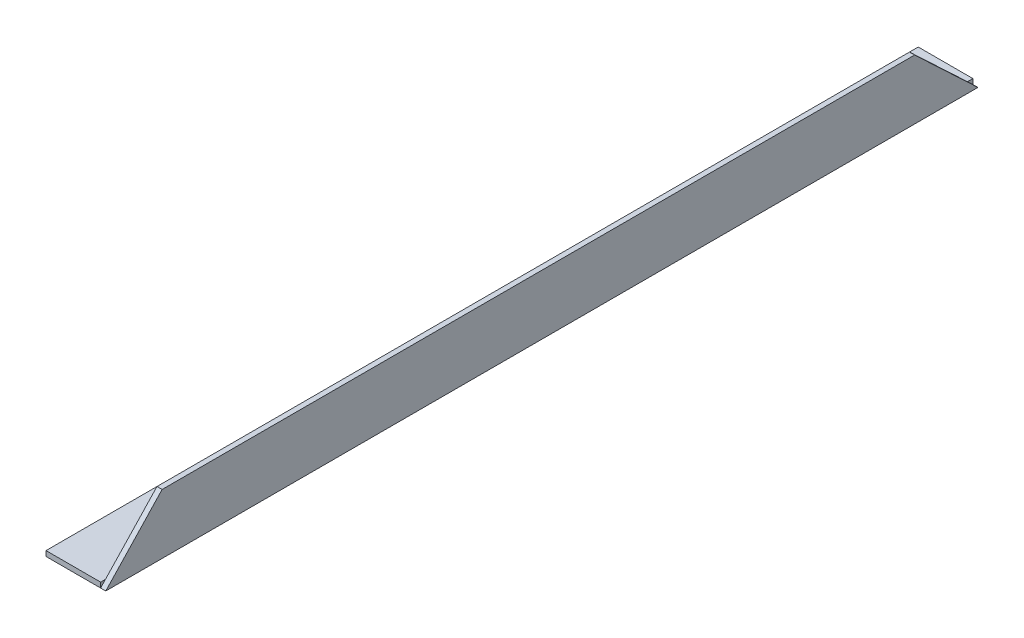
ISO-10303-21;
HEADER;
FILE_DESCRIPTION(('STEP AP214'),'2;1');
FILE_NAME('part.step','',(''),(''),'','','');
FILE_SCHEMA(('AUTOMOTIVE_DESIGN { 1 0 10303 214 1 1 1 1 }'));
ENDSEC;
DATA;
#1=APPLICATION_CONTEXT('core data for automotive mechanical design processes');
#2=APPLICATION_PROTOCOL_DEFINITION('international standard','automotive_design',2000,#1);
#3=PRODUCT_CONTEXT('',#1,'mechanical');
#4=PRODUCT('Part','Part','',(#3));
#5=PRODUCT_RELATED_PRODUCT_CATEGORY('part','',(#4));
#6=PRODUCT_DEFINITION_FORMATION('','',#4);
#7=PRODUCT_DEFINITION_CONTEXT('part definition',#1,'design');
#8=PRODUCT_DEFINITION('design','',#6,#7);
#9=PRODUCT_DEFINITION_SHAPE('','',#8);
#10=(LENGTH_UNIT() NAMED_UNIT(*) SI_UNIT(.MILLI.,.METRE.));
#11=(NAMED_UNIT(*) PLANE_ANGLE_UNIT() SI_UNIT($,.RADIAN.));
#12=(NAMED_UNIT(*) SI_UNIT($,.STERADIAN.) SOLID_ANGLE_UNIT());
#13=UNCERTAINTY_MEASURE_WITH_UNIT(LENGTH_MEASURE(1.E-05),#10,'distance_accuracy_value','');
#14=(GEOMETRIC_REPRESENTATION_CONTEXT(3) GLOBAL_UNCERTAINTY_ASSIGNED_CONTEXT((#13)) GLOBAL_UNIT_ASSIGNED_CONTEXT((#10,
#11,#12)) REPRESENTATION_CONTEXT('',''));
#15=CARTESIAN_POINT('',(0.,0.,0.));
#16=DIRECTION('',(0.,0.,1.));
#17=DIRECTION('',(1.,0.,0.));
#18=AXIS2_PLACEMENT_3D('',#15,#16,#17);
#19=CARTESIAN_POINT('',(2.,23.3,177.01847832566));
#20=DIRECTION('',(0.,-0.68592997100132,-0.727667557942587));
#21=DIRECTION('',(0.,0.727667557942587,-0.68592997100132));
#22=AXIS2_PLACEMENT_3D('',#19,#20,#21);
#23=PLANE('',#22);
#24=DIRECTION('',(0.,-0.727667557942587,0.68592997100132));
#25=VECTOR('',#24,1.);
#26=CARTESIAN_POINT('',(0.,23.3,177.01847832566));
#27=LINE('',#26,#25);
#28=CARTESIAN_POINT('',(0.,23.3,177.01847832566));
#29=VERTEX_POINT('',#28);
#30=CARTESIAN_POINT('',(0.,2.,197.096752013767));
#31=VERTEX_POINT('',#30);
#32=EDGE_CURVE('E135',#29,#31,#27,.T.);
#33=ORIENTED_EDGE('',*,*,#32,.T.);
#34=CARTESIAN_POINT('',(0.,0.,198.982035928144));
#35=VERTEX_POINT('',#34);
#36=EDGE_CURVE('E133',#31,#35,#27,.T.);
#37=ORIENTED_EDGE('',*,*,#36,.T.);
#38=DIRECTION('',(-1.,0.,0.));
#39=VECTOR('',#38,1.);
#40=CARTESIAN_POINT('',(2.,0.,198.982035928144));
#41=LINE('',#40,#39);
#42=CARTESIAN_POINT('',(2.,0.,198.982035928144));
#43=VERTEX_POINT('',#42);
#44=EDGE_CURVE('E36',#43,#35,#41,.T.);
#45=ORIENTED_EDGE('',*,*,#44,.F.);
#46=DIRECTION('',(0.,-0.727667557942587,0.68592997100132));
#47=VECTOR('',#46,1.);
#48=CARTESIAN_POINT('',(2.,23.3,177.01847832566));
#49=LINE('',#48,#47);
#50=CARTESIAN_POINT('',(2.,23.3,177.01847832566));
#51=VERTEX_POINT('',#50);
#52=EDGE_CURVE('E141',#51,#43,#49,.T.);
#53=ORIENTED_EDGE('',*,*,#52,.F.);
#54=DIRECTION('',(-1.,0.,0.));
#55=VECTOR('',#54,1.);
#56=CARTESIAN_POINT('',(2.,23.3,177.01847832566));
#57=LINE('',#56,#55);
#58=EDGE_CURVE('E146',#51,#29,#57,.T.);
#59=ORIENTED_EDGE('',*,*,#58,.T.);
#60=EDGE_LOOP('',(#33,#37,#45,#53,#59));
#61=FACE_BOUND('',#60,.T.);
#62=ADVANCED_FACE('F33',(#61),#23,.F.);
#63=CARTESIAN_POINT('',(2.,0.,198.982035928144));
#64=DIRECTION('',(0.,1.,0.));
#65=DIRECTION('',(0.,0.,1.));
#66=AXIS2_PLACEMENT_3D('',#63,#64,#65);
#67=PLANE('',#66);
#68=ORIENTED_EDGE('',*,*,#44,.T.);
#69=DIRECTION('',(1.,0.,0.));
#70=VECTOR('',#69,1.);
#71=CARTESIAN_POINT('',(-21.3,0.,198.982035928144));
#72=LINE('',#71,#70);
#73=CARTESIAN_POINT('',(-21.3,0.,198.982035928144));
#74=VERTEX_POINT('',#73);
#75=EDGE_CURVE('E116',#74,#35,#72,.T.);
#76=ORIENTED_EDGE('',*,*,#75,.F.);
#77=DIRECTION('',(0.,0.,1.));
#78=VECTOR('',#77,1.);
#79=CARTESIAN_POINT('',(-21.3,0.,-141.017964071856));
#80=LINE('',#79,#78);
#81=CARTESIAN_POINT('',(-21.3,0.,-141.017964071856));
#82=VERTEX_POINT('',#81);
#83=EDGE_CURVE('E109',#82,#74,#80,.T.);
#84=ORIENTED_EDGE('',*,*,#83,.F.);
#85=DIRECTION('',(1.,0.,0.));
#86=VECTOR('',#85,1.);
#87=CARTESIAN_POINT('',(-21.3,0.,-141.017964071856));
#88=LINE('',#87,#86);
#89=CARTESIAN_POINT('',(0.,0.,-141.017964071856));
#90=VERTEX_POINT('',#89);
#91=EDGE_CURVE('E113',#82,#90,#88,.T.);
#92=ORIENTED_EDGE('',*,*,#91,.T.);
#93=DIRECTION('',(-1.,0.,0.));
#94=VECTOR('',#93,1.);
#95=CARTESIAN_POINT('',(2.,0.,-141.017964071856));
#96=LINE('',#95,#94);
#97=CARTESIAN_POINT('',(2.,0.,-141.017964071856));
#98=VERTEX_POINT('',#97);
#99=EDGE_CURVE('E154',#98,#90,#96,.T.);
#100=ORIENTED_EDGE('',*,*,#99,.F.);
#101=DIRECTION('',(0.,0.,-1.));
#102=VECTOR('',#101,1.);
#103=CARTESIAN_POINT('',(2.,0.,198.982035928144));
#104=LINE('',#103,#102);
#105=EDGE_CURVE('E86',#43,#98,#104,.T.);
#106=ORIENTED_EDGE('',*,*,#105,.F.);
#107=EDGE_LOOP('',(#68,#76,#84,#92,#100,#106));
#108=FACE_BOUND('',#107,.T.);
#109=ADVANCED_FACE('F111',(#108),#67,.F.);
#110=CARTESIAN_POINT('',(2.,0.,-141.017964071856));
#111=DIRECTION('',(0.,-0.727667557942586,0.685929971001322));
#112=DIRECTION('',(0.,-0.685929971001322,-0.727667557942586));
#113=AXIS2_PLACEMENT_3D('',#110,#111,#112);
#114=PLANE('',#113);
#115=DIRECTION('',(0.,0.685929971001322,0.727667557942586));
#116=VECTOR('',#115,1.);
#117=CARTESIAN_POINT('',(0.,0.,-141.017964071856));
#118=LINE('',#117,#116);
#119=CARTESIAN_POINT('',(0.,2.,-138.896267721775));
#120=VERTEX_POINT('',#119);
#121=EDGE_CURVE('E149',#90,#120,#118,.T.);
#122=ORIENTED_EDGE('',*,*,#121,.T.);
#123=CARTESIAN_POINT('',(0.,23.3000000000001,-116.300201593404));
#124=VERTEX_POINT('',#123);
#125=EDGE_CURVE('E148',#120,#124,#118,.T.);
#126=ORIENTED_EDGE('',*,*,#125,.T.);
#127=DIRECTION('',(-1.,0.,0.));
#128=VECTOR('',#127,1.);
#129=CARTESIAN_POINT('',(2.,23.3000000000001,-116.300201593404));
#130=LINE('',#129,#128);
#131=CARTESIAN_POINT('',(2.,23.3000000000001,-116.300201593404));
#132=VERTEX_POINT('',#131);
#133=EDGE_CURVE('E153',#132,#124,#130,.T.);
#134=ORIENTED_EDGE('',*,*,#133,.F.);
#135=DIRECTION('',(0.,0.685929971001322,0.727667557942586));
#136=VECTOR('',#135,1.);
#137=CARTESIAN_POINT('',(2.,0.,-141.017964071856));
#138=LINE('',#137,#136);
#139=EDGE_CURVE('E144',#98,#132,#138,.T.);
#140=ORIENTED_EDGE('',*,*,#139,.F.);
#141=ORIENTED_EDGE('',*,*,#99,.T.);
#142=EDGE_LOOP('',(#122,#126,#134,#140,#141));
#143=FACE_BOUND('',#142,.T.);
#144=ADVANCED_FACE('F183',(#143),#114,.F.);
#145=CARTESIAN_POINT('',(2.,23.3000000000001,-116.300201593404));
#146=DIRECTION('',(0.,-1.,0.));
#147=DIRECTION('',(0.,0.,-1.));
#148=AXIS2_PLACEMENT_3D('',#145,#146,#147);
#149=PLANE('',#148);
#150=DIRECTION('',(0.,0.,1.));
#151=VECTOR('',#150,1.);
#152=CARTESIAN_POINT('',(0.,23.3000000000001,-116.300201593404));
#153=LINE('',#152,#151);
#154=EDGE_CURVE('E78',#124,#29,#153,.T.);
#155=ORIENTED_EDGE('',*,*,#154,.T.);
#156=ORIENTED_EDGE('',*,*,#58,.F.);
#157=DIRECTION('',(0.,0.,1.));
#158=VECTOR('',#157,1.);
#159=CARTESIAN_POINT('',(2.,23.3000000000001,-116.300201593404));
#160=LINE('',#159,#158);
#161=EDGE_CURVE('E57',#132,#51,#160,.T.);
#162=ORIENTED_EDGE('',*,*,#161,.F.);
#163=ORIENTED_EDGE('',*,*,#133,.T.);
#164=EDGE_LOOP('',(#155,#156,#162,#163));
#165=FACE_BOUND('',#164,.T.);
#166=ADVANCED_FACE('F186',(#165),#149,.F.);
#167=CARTESIAN_POINT('',(2.,0.,0.));
#168=DIRECTION('',(-1.,0.,0.));
#169=DIRECTION('',(0.,0.,1.));
#170=AXIS2_PLACEMENT_3D('',#167,#168,#169);
#171=PLANE('',#170);
#172=ORIENTED_EDGE('',*,*,#52,.T.);
#173=ORIENTED_EDGE('',*,*,#105,.T.);
#174=ORIENTED_EDGE('',*,*,#139,.T.);
#175=ORIENTED_EDGE('',*,*,#161,.T.);
#176=EDGE_LOOP('',(#172,#173,#174,#175));
#177=FACE_BOUND('',#176,.T.);
#178=ADVANCED_FACE('F187',(#177),#171,.F.);
#179=CARTESIAN_POINT('',(0.,0.,0.));
#180=DIRECTION('',(-1.,0.,0.));
#181=DIRECTION('',(0.,0.,1.));
#182=AXIS2_PLACEMENT_3D('',#179,#180,#181);
#183=PLANE('',#182);
#184=DIRECTION('',(0.,0.,-1.));
#185=VECTOR('',#184,1.);
#186=CARTESIAN_POINT('',(0.,2.,-141.017964071856));
#187=LINE('',#186,#185);
#188=EDGE_CURVE('E11',#31,#120,#187,.T.);
#189=ORIENTED_EDGE('',*,*,#188,.F.);
#190=ORIENTED_EDGE('',*,*,#32,.F.);
#191=ORIENTED_EDGE('',*,*,#154,.F.);
#192=ORIENTED_EDGE('',*,*,#125,.F.);
#193=EDGE_LOOP('',(#189,#190,#191,#192));
#194=FACE_BOUND('',#193,.T.);
#195=ADVANCED_FACE('F185',(#194),#183,.T.);
#196=CARTESIAN_POINT('',(0.,0.,0.));
#197=DIRECTION('',(1.,0.,0.));
#198=DIRECTION('',(0.,0.,-1.));
#199=AXIS2_PLACEMENT_3D('',#196,#197,#198);
#200=PLANE('',#199);
#201=ORIENTED_EDGE('',*,*,#36,.F.);
#202=CARTESIAN_POINT('',(0.,2.,198.982035928144));
#203=VERTEX_POINT('',#202);
#204=EDGE_CURVE('E42',#203,#31,#187,.T.);
#205=ORIENTED_EDGE('',*,*,#204,.F.);
#206=DIRECTION('',(0.,1.,0.));
#207=VECTOR('',#206,1.);
#208=CARTESIAN_POINT('',(0.,0.,198.982035928144));
#209=LINE('',#208,#207);
#210=EDGE_CURVE('E165',#35,#203,#209,.T.);
#211=ORIENTED_EDGE('',*,*,#210,.F.);
#212=EDGE_LOOP('',(#201,#205,#211));
#213=FACE_BOUND('',#212,.T.);
#214=ADVANCED_FACE('F170',(#213),#200,.T.);
#215=ORIENTED_EDGE('',*,*,#121,.F.);
#216=DIRECTION('',(0.,-1.,0.));
#217=VECTOR('',#216,1.);
#218=CARTESIAN_POINT('',(0.,0.,-141.017964071856));
#219=LINE('',#218,#217);
#220=CARTESIAN_POINT('',(0.,2.,-141.017964071856));
#221=VERTEX_POINT('',#220);
#222=EDGE_CURVE('E132',#221,#90,#219,.T.);
#223=ORIENTED_EDGE('',*,*,#222,.F.);
#224=EDGE_CURVE('E43',#120,#221,#187,.T.);
#225=ORIENTED_EDGE('',*,*,#224,.F.);
#226=EDGE_LOOP('',(#215,#223,#225));
#227=FACE_BOUND('',#226,.T.);
#228=ADVANCED_FACE('F182',(#227),#200,.T.);
#229=CARTESIAN_POINT('',(-21.3,0.,-141.017964071856));
#230=DIRECTION('',(0.,0.,1.));
#231=DIRECTION('',(1.,0.,0.));
#232=AXIS2_PLACEMENT_3D('',#229,#230,#231);
#233=PLANE('',#232);
#234=ORIENTED_EDGE('',*,*,#222,.T.);
#235=ORIENTED_EDGE('',*,*,#91,.F.);
#236=DIRECTION('',(0.,-1.,0.));
#237=VECTOR('',#236,1.);
#238=CARTESIAN_POINT('',(-21.3,0.,-141.017964071856));
#239=LINE('',#238,#237);
#240=CARTESIAN_POINT('',(-21.3,2.,-141.017964071856));
#241=VERTEX_POINT('',#240);
#242=EDGE_CURVE('E120',#241,#82,#239,.T.);
#243=ORIENTED_EDGE('',*,*,#242,.F.);
#244=DIRECTION('',(1.,0.,0.));
#245=VECTOR('',#244,1.);
#246=CARTESIAN_POINT('',(-21.3,2.,-141.017964071856));
#247=LINE('',#246,#245);
#248=EDGE_CURVE('E176',#241,#221,#247,.T.);
#249=ORIENTED_EDGE('',*,*,#248,.T.);
#250=EDGE_LOOP('',(#234,#235,#243,#249));
#251=FACE_BOUND('',#250,.T.);
#252=ADVANCED_FACE('F130',(#251),#233,.F.);
#253=CARTESIAN_POINT('',(-21.3,0.,198.982035928144));
#254=DIRECTION('',(0.,0.,-1.));
#255=DIRECTION('',(0.,1.,0.));
#256=AXIS2_PLACEMENT_3D('',#253,#254,#255);
#257=PLANE('',#256);
#258=ORIENTED_EDGE('',*,*,#210,.T.);
#259=DIRECTION('',(1.,0.,0.));
#260=VECTOR('',#259,1.);
#261=CARTESIAN_POINT('',(-21.3,2.,198.982035928144));
#262=LINE('',#261,#260);
#263=CARTESIAN_POINT('',(-21.3,2.,198.982035928144));
#264=VERTEX_POINT('',#263);
#265=EDGE_CURVE('E137',#264,#203,#262,.T.);
#266=ORIENTED_EDGE('',*,*,#265,.F.);
#267=DIRECTION('',(0.,1.,0.));
#268=VECTOR('',#267,1.);
#269=CARTESIAN_POINT('',(-21.3,0.,198.982035928144));
#270=LINE('',#269,#268);
#271=EDGE_CURVE('E119',#74,#264,#270,.T.);
#272=ORIENTED_EDGE('',*,*,#271,.F.);
#273=ORIENTED_EDGE('',*,*,#75,.T.);
#274=EDGE_LOOP('',(#258,#266,#272,#273));
#275=FACE_BOUND('',#274,.T.);
#276=ADVANCED_FACE('F163',(#275),#257,.F.);
#277=CARTESIAN_POINT('',(-21.3,2.,-141.017964071856));
#278=DIRECTION('',(0.,-1.,0.));
#279=DIRECTION('',(0.,0.,-1.));
#280=AXIS2_PLACEMENT_3D('',#277,#278,#279);
#281=PLANE('',#280);
#282=ORIENTED_EDGE('',*,*,#204,.T.);
#283=ORIENTED_EDGE('',*,*,#188,.T.);
#284=ORIENTED_EDGE('',*,*,#224,.T.);
#285=ORIENTED_EDGE('',*,*,#248,.F.);
#286=DIRECTION('',(0.,0.,-1.));
#287=VECTOR('',#286,1.);
#288=CARTESIAN_POINT('',(-21.3,2.,-141.017964071856));
#289=LINE('',#288,#287);
#290=EDGE_CURVE('E125',#264,#241,#289,.T.);
#291=ORIENTED_EDGE('',*,*,#290,.F.);
#292=ORIENTED_EDGE('',*,*,#265,.T.);
#293=EDGE_LOOP('',(#282,#283,#284,#285,#291,#292));
#294=FACE_BOUND('',#293,.T.);
#295=ADVANCED_FACE('F178',(#294),#281,.F.);
#296=CARTESIAN_POINT('',(-21.3,0.,0.));
#297=DIRECTION('',(1.,0.,0.));
#298=DIRECTION('',(0.,0.,-1.));
#299=AXIS2_PLACEMENT_3D('',#296,#297,#298);
#300=PLANE('',#299);
#301=ORIENTED_EDGE('',*,*,#242,.T.);
#302=ORIENTED_EDGE('',*,*,#83,.T.);
#303=ORIENTED_EDGE('',*,*,#271,.T.);
#304=ORIENTED_EDGE('',*,*,#290,.T.);
#305=EDGE_LOOP('',(#301,#302,#303,#304));
#306=FACE_BOUND('',#305,.T.);
#307=ADVANCED_FACE('F123',(#306),#300,.F.);
#308=CLOSED_SHELL('',(#62,#109,#144,#166,#178,#195,#214,#228,#252,#276,#295,#307));
#309=MANIFOLD_SOLID_BREP('B2',#308);
#310=ADVANCED_BREP_SHAPE_REPRESENTATION('',(#18,#309),#14);
#311=SHAPE_DEFINITION_REPRESENTATION(#9,#310);
ENDSEC;
END-ISO-10303-21;
